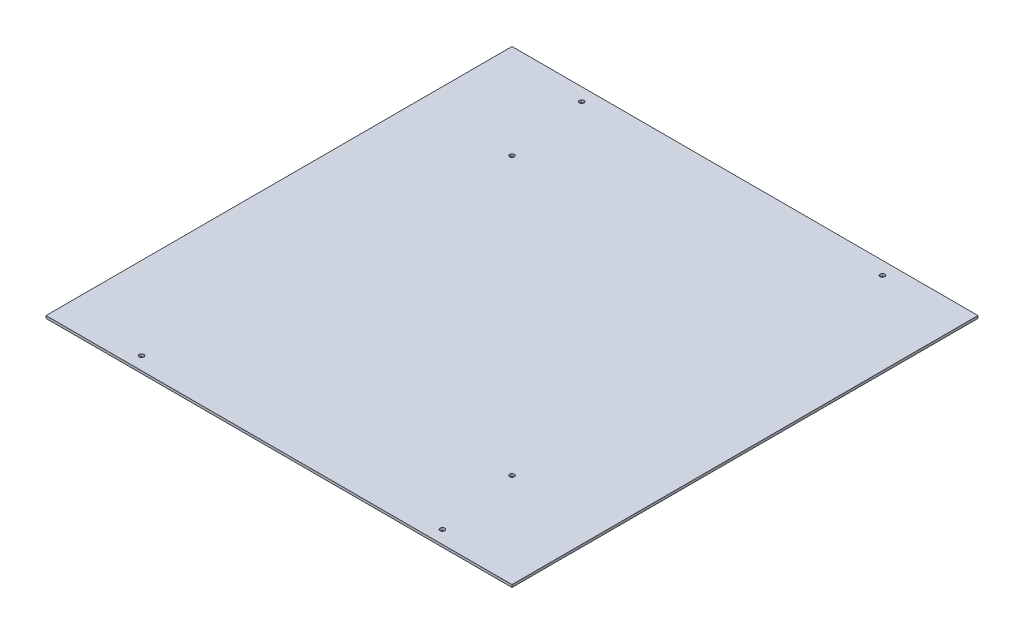
ISO-10303-21;
HEADER;
FILE_DESCRIPTION(('STEP AP214'),'2;1');
FILE_NAME('part.step','',(''),(''),'','','');
FILE_SCHEMA(('AUTOMOTIVE_DESIGN { 1 0 10303 214 1 1 1 1 }'));
ENDSEC;
DATA;
#1=APPLICATION_CONTEXT('core data for automotive mechanical design processes');
#2=APPLICATION_PROTOCOL_DEFINITION('international standard','automotive_design',2000,#1);
#3=PRODUCT_CONTEXT('',#1,'mechanical');
#4=PRODUCT('Part','Part','',(#3));
#5=PRODUCT_RELATED_PRODUCT_CATEGORY('part','',(#4));
#6=PRODUCT_DEFINITION_FORMATION('','',#4);
#7=PRODUCT_DEFINITION_CONTEXT('part definition',#1,'design');
#8=PRODUCT_DEFINITION('design','',#6,#7);
#9=PRODUCT_DEFINITION_SHAPE('','',#8);
#10=(LENGTH_UNIT() NAMED_UNIT(*) SI_UNIT(.MILLI.,.METRE.));
#11=(NAMED_UNIT(*) PLANE_ANGLE_UNIT() SI_UNIT($,.RADIAN.));
#12=(NAMED_UNIT(*) SI_UNIT($,.STERADIAN.) SOLID_ANGLE_UNIT());
#13=UNCERTAINTY_MEASURE_WITH_UNIT(LENGTH_MEASURE(1.E-05),#10,'distance_accuracy_value','');
#14=(GEOMETRIC_REPRESENTATION_CONTEXT(3) GLOBAL_UNCERTAINTY_ASSIGNED_CONTEXT((#13)) GLOBAL_UNIT_ASSIGNED_CONTEXT((#10,
#11,#12)) REPRESENTATION_CONTEXT('',''));
#15=CARTESIAN_POINT('',(0.,0.,0.));
#16=DIRECTION('',(0.,0.,1.));
#17=DIRECTION('',(1.,0.,0.));
#18=AXIS2_PLACEMENT_3D('',#15,#16,#17);
#19=CARTESIAN_POINT('',(0.,1.9,0.));
#20=DIRECTION('',(1.,0.,0.));
#21=DIRECTION('',(0.,0.,-1.));
#22=AXIS2_PLACEMENT_3D('',#19,#20,#21);
#23=PLANE('',#22);
#24=DIRECTION('',(0.,0.,1.));
#25=VECTOR('',#24,1.);
#26=CARTESIAN_POINT('',(0.,0.,0.));
#27=LINE('',#26,#25);
#28=CARTESIAN_POINT('',(0.,0.,-350.));
#29=VERTEX_POINT('',#28);
#30=CARTESIAN_POINT('',(0.,0.,0.));
#31=VERTEX_POINT('',#30);
#32=EDGE_CURVE('E100',#29,#31,#27,.T.);
#33=ORIENTED_EDGE('',*,*,#32,.T.);
#34=DIRECTION('',(0.,-1.,0.));
#35=VECTOR('',#34,1.);
#36=CARTESIAN_POINT('',(0.,1.9,0.));
#37=LINE('',#36,#35);
#38=CARTESIAN_POINT('',(0.,1.9,0.));
#39=VERTEX_POINT('',#38);
#40=EDGE_CURVE('E11',#39,#31,#37,.T.);
#41=ORIENTED_EDGE('',*,*,#40,.F.);
#42=DIRECTION('',(0.,0.,1.));
#43=VECTOR('',#42,1.);
#44=CARTESIAN_POINT('',(0.,1.9,0.));
#45=LINE('',#44,#43);
#46=CARTESIAN_POINT('',(0.,1.9,-350.));
#47=VERTEX_POINT('',#46);
#48=EDGE_CURVE('E88',#47,#39,#45,.T.);
#49=ORIENTED_EDGE('',*,*,#48,.F.);
#50=DIRECTION('',(0.,-1.,0.));
#51=VECTOR('',#50,1.);
#52=CARTESIAN_POINT('',(0.,1.9,-350.));
#53=LINE('',#52,#51);
#54=EDGE_CURVE('E96',#47,#29,#53,.T.);
#55=ORIENTED_EDGE('',*,*,#54,.T.);
#56=EDGE_LOOP('',(#33,#41,#49,#55));
#57=FACE_BOUND('',#56,.T.);
#58=ADVANCED_FACE('F37',(#57),#23,.F.);
#59=CARTESIAN_POINT('',(0.,1.9,0.));
#60=DIRECTION('',(0.,0.,-1.));
#61=DIRECTION('',(-1.,0.,0.));
#62=AXIS2_PLACEMENT_3D('',#59,#60,#61);
#63=PLANE('',#62);
#64=DIRECTION('',(1.,0.,0.));
#65=VECTOR('',#64,1.);
#66=CARTESIAN_POINT('',(0.,0.,0.));
#67=LINE('',#66,#65);
#68=CARTESIAN_POINT('',(350.,0.,0.));
#69=VERTEX_POINT('',#68);
#70=EDGE_CURVE('E92',#31,#69,#67,.T.);
#71=ORIENTED_EDGE('',*,*,#70,.T.);
#72=DIRECTION('',(0.,-1.,0.));
#73=VECTOR('',#72,1.);
#74=CARTESIAN_POINT('',(350.,1.9,0.));
#75=LINE('',#74,#73);
#76=CARTESIAN_POINT('',(350.,1.9,0.));
#77=VERTEX_POINT('',#76);
#78=EDGE_CURVE('E45',#77,#69,#75,.T.);
#79=ORIENTED_EDGE('',*,*,#78,.F.);
#80=DIRECTION('',(1.,0.,0.));
#81=VECTOR('',#80,1.);
#82=CARTESIAN_POINT('',(0.,1.9,0.));
#83=LINE('',#82,#81);
#84=EDGE_CURVE('E83',#39,#77,#83,.T.);
#85=ORIENTED_EDGE('',*,*,#84,.F.);
#86=ORIENTED_EDGE('',*,*,#40,.T.);
#87=EDGE_LOOP('',(#71,#79,#85,#86));
#88=FACE_BOUND('',#87,.T.);
#89=ADVANCED_FACE('F91',(#88),#63,.F.);
#90=CARTESIAN_POINT('',(350.,1.9,0.));
#91=DIRECTION('',(-1.,0.,0.));
#92=DIRECTION('',(0.,0.,1.));
#93=AXIS2_PLACEMENT_3D('',#90,#91,#92);
#94=PLANE('',#93);
#95=DIRECTION('',(0.,0.,-1.));
#96=VECTOR('',#95,1.);
#97=CARTESIAN_POINT('',(350.,0.,0.));
#98=LINE('',#97,#96);
#99=CARTESIAN_POINT('',(350.,0.,-350.));
#100=VERTEX_POINT('',#99);
#101=EDGE_CURVE('E70',#69,#100,#98,.T.);
#102=ORIENTED_EDGE('',*,*,#101,.T.);
#103=DIRECTION('',(0.,-1.,0.));
#104=VECTOR('',#103,1.);
#105=CARTESIAN_POINT('',(350.,1.9,-350.));
#106=LINE('',#105,#104);
#107=CARTESIAN_POINT('',(350.,1.9,-350.));
#108=VERTEX_POINT('',#107);
#109=EDGE_CURVE('E93',#108,#100,#106,.T.);
#110=ORIENTED_EDGE('',*,*,#109,.F.);
#111=DIRECTION('',(0.,0.,-1.));
#112=VECTOR('',#111,1.);
#113=CARTESIAN_POINT('',(350.,1.9,0.));
#114=LINE('',#113,#112);
#115=EDGE_CURVE('E86',#77,#108,#114,.T.);
#116=ORIENTED_EDGE('',*,*,#115,.F.);
#117=ORIENTED_EDGE('',*,*,#78,.T.);
#118=EDGE_LOOP('',(#102,#110,#116,#117));
#119=FACE_BOUND('',#118,.T.);
#120=ADVANCED_FACE('F94',(#119),#94,.F.);
#121=CARTESIAN_POINT('',(0.,1.9,-350.));
#122=DIRECTION('',(0.,0.,1.));
#123=DIRECTION('',(1.,0.,0.));
#124=AXIS2_PLACEMENT_3D('',#121,#122,#123);
#125=PLANE('',#124);
#126=DIRECTION('',(-1.,0.,0.));
#127=VECTOR('',#126,1.);
#128=CARTESIAN_POINT('',(0.,0.,-350.));
#129=LINE('',#128,#127);
#130=EDGE_CURVE('E76',#100,#29,#129,.T.);
#131=ORIENTED_EDGE('',*,*,#130,.T.);
#132=ORIENTED_EDGE('',*,*,#54,.F.);
#133=DIRECTION('',(-1.,0.,0.));
#134=VECTOR('',#133,1.);
#135=CARTESIAN_POINT('',(0.,1.9,-350.));
#136=LINE('',#135,#134);
#137=EDGE_CURVE('E53',#108,#47,#136,.T.);
#138=ORIENTED_EDGE('',*,*,#137,.F.);
#139=ORIENTED_EDGE('',*,*,#109,.T.);
#140=EDGE_LOOP('',(#131,#132,#138,#139));
#141=FACE_BOUND('',#140,.T.);
#142=ADVANCED_FACE('F108',(#141),#125,.F.);
#143=CARTESIAN_POINT('',(0.,1.9,0.));
#144=DIRECTION('',(0.,-1.,0.));
#145=DIRECTION('',(0.,0.,-1.));
#146=AXIS2_PLACEMENT_3D('',#143,#144,#145);
#147=PLANE('',#146);
#148=CARTESIAN_POINT('',(71.,1.9,-279.));
#149=DIRECTION('',(0.,1.,0.));
#150=DIRECTION('',(0.,0.,1.));
#151=AXIS2_PLACEMENT_3D('',#148,#149,#150);
#152=CIRCLE('',#151,1.75);
#153=CARTESIAN_POINT('',(71.,1.9,-277.25));
#154=VERTEX_POINT('',#153);
#155=EDGE_CURVE('E132',#154,#154,#152,.T.);
#156=ORIENTED_EDGE('',*,*,#155,.F.);
#157=EDGE_LOOP('',(#156));
#158=FACE_BOUND('',#157,.T.);
#159=CARTESIAN_POINT('',(288.,1.9,-9.75));
#160=DIRECTION('',(0.,1.,0.));
#161=DIRECTION('',(0.,0.,1.));
#162=AXIS2_PLACEMENT_3D('',#159,#160,#161);
#163=CIRCLE('',#162,1.74999999999998);
#164=CARTESIAN_POINT('',(288.,1.9,-8.00000000000002));
#165=VERTEX_POINT('',#164);
#166=EDGE_CURVE('E139',#165,#165,#163,.T.);
#167=ORIENTED_EDGE('',*,*,#166,.F.);
#168=EDGE_LOOP('',(#167));
#169=FACE_BOUND('',#168,.T.);
#170=CARTESIAN_POINT('',(62.,1.9,-9.75));
#171=DIRECTION('',(0.,1.,0.));
#172=DIRECTION('',(0.,0.,1.));
#173=AXIS2_PLACEMENT_3D('',#170,#171,#172);
#174=CIRCLE('',#173,1.75);
#175=CARTESIAN_POINT('',(62.,1.9,-8.00000000000001));
#176=VERTEX_POINT('',#175);
#177=EDGE_CURVE('E120',#176,#176,#174,.T.);
#178=ORIENTED_EDGE('',*,*,#177,.F.);
#179=EDGE_LOOP('',(#178));
#180=FACE_BOUND('',#179,.T.);
#181=CARTESIAN_POINT('',(288.,1.9,-340.25));
#182=DIRECTION('',(0.,1.,0.));
#183=DIRECTION('',(0.,0.,1.));
#184=AXIS2_PLACEMENT_3D('',#181,#182,#183);
#185=CIRCLE('',#184,1.74999999999998);
#186=CARTESIAN_POINT('',(288.,1.9,-338.5));
#187=VERTEX_POINT('',#186);
#188=EDGE_CURVE('E127',#187,#187,#185,.T.);
#189=ORIENTED_EDGE('',*,*,#188,.F.);
#190=EDGE_LOOP('',(#189));
#191=FACE_BOUND('',#190,.T.);
#192=CARTESIAN_POINT('',(279.007361648572,1.9,-71.));
#193=DIRECTION('',(0.,1.,0.));
#194=DIRECTION('',(0.,0.,1.));
#195=AXIS2_PLACEMENT_3D('',#192,#193,#194);
#196=CIRCLE('',#195,1.75000000000004);
#197=CARTESIAN_POINT('',(279.007361648572,1.9,-69.25));
#198=VERTEX_POINT('',#197);
#199=EDGE_CURVE('E144',#198,#198,#196,.T.);
#200=ORIENTED_EDGE('',*,*,#199,.F.);
#201=EDGE_LOOP('',(#200));
#202=FACE_BOUND('',#201,.T.);
#203=CARTESIAN_POINT('',(62.,1.9,-340.25));
#204=DIRECTION('',(0.,1.,0.));
#205=DIRECTION('',(0.,0.,1.));
#206=AXIS2_PLACEMENT_3D('',#203,#204,#205);
#207=CIRCLE('',#206,1.75);
#208=CARTESIAN_POINT('',(62.,1.9,-338.5));
#209=VERTEX_POINT('',#208);
#210=EDGE_CURVE('E114',#209,#209,#207,.T.);
#211=ORIENTED_EDGE('',*,*,#210,.F.);
#212=EDGE_LOOP('',(#211));
#213=FACE_BOUND('',#212,.T.);
#214=ORIENTED_EDGE('',*,*,#48,.T.);
#215=ORIENTED_EDGE('',*,*,#84,.T.);
#216=ORIENTED_EDGE('',*,*,#115,.T.);
#217=ORIENTED_EDGE('',*,*,#137,.T.);
#218=EDGE_LOOP('',(#214,#215,#216,#217));
#219=FACE_BOUND('',#218,.T.);
#220=ADVANCED_FACE('F84',(#158,#169,#180,#191,#202,#213,#219),#147,.F.);
#221=CARTESIAN_POINT('',(0.,0.,0.));
#222=DIRECTION('',(0.,-1.,0.));
#223=DIRECTION('',(0.,0.,-1.));
#224=AXIS2_PLACEMENT_3D('',#221,#222,#223);
#225=PLANE('',#224);
#226=CARTESIAN_POINT('',(71.,0.,-279.));
#227=DIRECTION('',(0.,1.,0.));
#228=DIRECTION('',(0.,0.,1.));
#229=AXIS2_PLACEMENT_3D('',#226,#227,#228);
#230=CIRCLE('',#229,1.75);
#231=CARTESIAN_POINT('',(71.,0.,-277.25));
#232=VERTEX_POINT('',#231);
#233=EDGE_CURVE('E135',#232,#232,#230,.T.);
#234=ORIENTED_EDGE('',*,*,#233,.T.);
#235=EDGE_LOOP('',(#234));
#236=FACE_BOUND('',#235,.T.);
#237=CARTESIAN_POINT('',(288.,0.,-9.75));
#238=DIRECTION('',(0.,1.,0.));
#239=DIRECTION('',(0.,0.,1.));
#240=AXIS2_PLACEMENT_3D('',#237,#238,#239);
#241=CIRCLE('',#240,1.74999999999998);
#242=CARTESIAN_POINT('',(288.,0.,-8.00000000000002));
#243=VERTEX_POINT('',#242);
#244=EDGE_CURVE('E124',#243,#243,#241,.T.);
#245=ORIENTED_EDGE('',*,*,#244,.T.);
#246=EDGE_LOOP('',(#245));
#247=FACE_BOUND('',#246,.T.);
#248=CARTESIAN_POINT('',(62.,0.,-9.75));
#249=DIRECTION('',(0.,1.,0.));
#250=DIRECTION('',(0.,0.,1.));
#251=AXIS2_PLACEMENT_3D('',#248,#249,#250);
#252=CIRCLE('',#251,1.75);
#253=CARTESIAN_POINT('',(62.,0.,-8.00000000000001));
#254=VERTEX_POINT('',#253);
#255=EDGE_CURVE('E123',#254,#254,#252,.T.);
#256=ORIENTED_EDGE('',*,*,#255,.T.);
#257=EDGE_LOOP('',(#256));
#258=FACE_BOUND('',#257,.T.);
#259=CARTESIAN_POINT('',(288.,0.,-340.25));
#260=DIRECTION('',(0.,1.,0.));
#261=DIRECTION('',(0.,0.,1.));
#262=AXIS2_PLACEMENT_3D('',#259,#260,#261);
#263=CIRCLE('',#262,1.74999999999998);
#264=CARTESIAN_POINT('',(288.,0.,-338.5));
#265=VERTEX_POINT('',#264);
#266=EDGE_CURVE('E117',#265,#265,#263,.T.);
#267=ORIENTED_EDGE('',*,*,#266,.T.);
#268=EDGE_LOOP('',(#267));
#269=FACE_BOUND('',#268,.T.);
#270=CARTESIAN_POINT('',(279.007361648572,0.,-71.));
#271=DIRECTION('',(0.,1.,0.));
#272=DIRECTION('',(0.,0.,1.));
#273=AXIS2_PLACEMENT_3D('',#270,#271,#272);
#274=CIRCLE('',#273,1.75000000000004);
#275=CARTESIAN_POINT('',(279.007361648572,0.,-69.25));
#276=VERTEX_POINT('',#275);
#277=EDGE_CURVE('E136',#276,#276,#274,.T.);
#278=ORIENTED_EDGE('',*,*,#277,.T.);
#279=EDGE_LOOP('',(#278));
#280=FACE_BOUND('',#279,.T.);
#281=CARTESIAN_POINT('',(62.,0.,-340.25));
#282=DIRECTION('',(0.,1.,0.));
#283=DIRECTION('',(0.,0.,1.));
#284=AXIS2_PLACEMENT_3D('',#281,#282,#283);
#285=CIRCLE('',#284,1.75);
#286=CARTESIAN_POINT('',(62.,0.,-338.5));
#287=VERTEX_POINT('',#286);
#288=EDGE_CURVE('E103',#287,#287,#285,.T.);
#289=ORIENTED_EDGE('',*,*,#288,.T.);
#290=EDGE_LOOP('',(#289));
#291=FACE_BOUND('',#290,.T.);
#292=ORIENTED_EDGE('',*,*,#32,.F.);
#293=ORIENTED_EDGE('',*,*,#130,.F.);
#294=ORIENTED_EDGE('',*,*,#101,.F.);
#295=ORIENTED_EDGE('',*,*,#70,.F.);
#296=EDGE_LOOP('',(#292,#293,#294,#295));
#297=FACE_BOUND('',#296,.T.);
#298=ADVANCED_FACE('F111',(#236,#247,#258,#269,#280,#291,#297),#225,.T.);
#299=CARTESIAN_POINT('',(62.,0.,-340.25));
#300=DIRECTION('',(0.,1.,0.));
#301=DIRECTION('',(0.,0.,1.));
#302=AXIS2_PLACEMENT_3D('',#299,#300,#301);
#303=CYLINDRICAL_SURFACE('',#302,1.75);
#304=CARTESIAN_POINT('',(62.,0.,-338.5));
#305=CARTESIAN_POINT('',(62.,0.0197916666666666,-338.5));
#306=CARTESIAN_POINT('',(62.,0.0395833333333333,-338.5));
#307=CARTESIAN_POINT('',(62.,0.0791666666666667,-338.5));
#308=CARTESIAN_POINT('',(62.,0.0989583333333333,-338.5));
#309=CARTESIAN_POINT('',(62.,0.138541666666667,-338.5));
#310=CARTESIAN_POINT('',(62.,0.158333333333333,-338.5));
#311=CARTESIAN_POINT('',(62.,0.197916666666667,-338.5));
#312=CARTESIAN_POINT('',(62.,0.217708333333333,-338.5));
#313=CARTESIAN_POINT('',(62.,0.257291666666667,-338.5));
#314=CARTESIAN_POINT('',(62.,0.277083333333333,-338.5));
#315=CARTESIAN_POINT('',(62.,0.316666666666667,-338.5));
#316=CARTESIAN_POINT('',(62.,0.336458333333333,-338.5));
#317=CARTESIAN_POINT('',(62.,0.376041666666667,-338.5));
#318=CARTESIAN_POINT('',(62.,0.395833333333333,-338.5));
#319=CARTESIAN_POINT('',(62.,0.435416666666667,-338.5));
#320=CARTESIAN_POINT('',(62.,0.455208333333333,-338.5));
#321=CARTESIAN_POINT('',(62.,0.494791666666667,-338.5));
#322=CARTESIAN_POINT('',(62.,0.514583333333333,-338.5));
#323=CARTESIAN_POINT('',(62.,0.554166666666667,-338.5));
#324=CARTESIAN_POINT('',(62.,0.573958333333333,-338.5));
#325=CARTESIAN_POINT('',(62.,0.613541666666667,-338.5));
#326=CARTESIAN_POINT('',(62.,0.633333333333333,-338.5));
#327=CARTESIAN_POINT('',(62.,0.672916666666667,-338.5));
#328=CARTESIAN_POINT('',(62.,0.692708333333333,-338.5));
#329=CARTESIAN_POINT('',(62.,0.732291666666667,-338.5));
#330=CARTESIAN_POINT('',(62.,0.752083333333333,-338.5));
#331=CARTESIAN_POINT('',(62.,0.791666666666667,-338.5));
#332=CARTESIAN_POINT('',(62.,0.811458333333333,-338.5));
#333=CARTESIAN_POINT('',(62.,0.851041666666667,-338.5));
#334=CARTESIAN_POINT('',(62.,0.870833333333333,-338.5));
#335=CARTESIAN_POINT('',(62.,0.910416666666667,-338.5));
#336=CARTESIAN_POINT('',(62.,0.930208333333333,-338.5));
#337=CARTESIAN_POINT('',(62.,0.969791666666667,-338.5));
#338=CARTESIAN_POINT('',(62.,0.989583333333333,-338.5));
#339=CARTESIAN_POINT('',(62.,1.02916666666667,-338.5));
#340=CARTESIAN_POINT('',(62.,1.04895833333333,-338.5));
#341=CARTESIAN_POINT('',(62.,1.08854166666667,-338.5));
#342=CARTESIAN_POINT('',(62.,1.10833333333333,-338.5));
#343=CARTESIAN_POINT('',(62.,1.14791666666667,-338.5));
#344=CARTESIAN_POINT('',(62.,1.16770833333333,-338.5));
#345=CARTESIAN_POINT('',(62.,1.20729166666667,-338.5));
#346=CARTESIAN_POINT('',(62.,1.22708333333333,-338.5));
#347=CARTESIAN_POINT('',(62.,1.26666666666667,-338.5));
#348=CARTESIAN_POINT('',(62.,1.28645833333333,-338.5));
#349=CARTESIAN_POINT('',(62.,1.32604166666667,-338.5));
#350=CARTESIAN_POINT('',(62.,1.34583333333333,-338.5));
#351=CARTESIAN_POINT('',(62.,1.38541666666667,-338.5));
#352=CARTESIAN_POINT('',(62.,1.40520833333333,-338.5));
#353=CARTESIAN_POINT('',(62.,1.44479166666667,-338.5));
#354=CARTESIAN_POINT('',(62.,1.46458333333333,-338.5));
#355=CARTESIAN_POINT('',(62.,1.50416666666667,-338.5));
#356=CARTESIAN_POINT('',(62.,1.52395833333333,-338.5));
#357=CARTESIAN_POINT('',(62.,1.56354166666667,-338.5));
#358=CARTESIAN_POINT('',(62.,1.58333333333333,-338.5));
#359=CARTESIAN_POINT('',(62.,1.62291666666667,-338.5));
#360=CARTESIAN_POINT('',(62.,1.64270833333333,-338.5));
#361=CARTESIAN_POINT('',(62.,1.68229166666667,-338.5));
#362=CARTESIAN_POINT('',(62.,1.70208333333333,-338.5));
#363=CARTESIAN_POINT('',(62.,1.74166666666667,-338.5));
#364=CARTESIAN_POINT('',(62.,1.76145833333333,-338.5));
#365=CARTESIAN_POINT('',(62.,1.80104166666667,-338.5));
#366=CARTESIAN_POINT('',(62.,1.82083333333333,-338.5));
#367=CARTESIAN_POINT('',(62.,1.86041666666667,-338.5));
#368=CARTESIAN_POINT('',(62.,1.88020833333333,-338.5));
#369=CARTESIAN_POINT('',(62.,1.9,-338.5));
#370=B_SPLINE_CURVE_WITH_KNOTS('',3,(#304,#305,#306,#307,#308,#309,#310,#311,#312,#313,#314,
#315,#316,#317,#318,#319,#320,#321,#322,#323,#324,#325,#326,#327,#328,#329,#330,#331,#332,#333,
#334,#335,#336,#337,#338,#339,#340,#341,#342,#343,#344,#345,#346,#347,#348,#349,#350,#351,#352,
#353,#354,#355,#356,#357,#358,#359,#360,#361,#362,#363,#364,#365,#366,#367,#368,#369),
.UNSPECIFIED.,.F.,.F.,(4,2,2,2,2,2,2,2,2,2,2,2,2,2,2,2,2,2,2,2,2,2,2,2,2,2,2,2,2,2,2,2,4),(0.,
0.059375,0.11875,0.178125,0.2375,0.296875,0.35625,0.415625,0.475,0.534375,0.59375,0.653125,
0.7125,0.771875,0.83125,0.890625,0.95,1.009375,1.06875,1.128125,1.1875,1.246875,1.30625,
1.365625,1.425,1.484375,1.54375,1.603125,1.6625,1.721875,1.78125,1.840625,1.9),.UNSPECIFIED.);
#371=EDGE_CURVE('BSEAM156',#287,#209,#370,.T.);
#372=ORIENTED_EDGE('',*,*,#288,.F.);
#373=ORIENTED_EDGE('',*,*,#210,.T.);
#374=ORIENTED_EDGE('',*,*,#371,.T.);
#375=ORIENTED_EDGE('',*,*,#371,.F.);
#376=EDGE_LOOP('',(#372,#374,#373,#375));
#377=FACE_BOUND('',#376,.T.);
#378=ADVANCED_FACE('F156',(#377),#303,.F.);
#379=CARTESIAN_POINT('',(279.007361648572,0.,-71.));
#380=DIRECTION('',(0.,1.,0.));
#381=DIRECTION('',(0.,0.,1.));
#382=AXIS2_PLACEMENT_3D('',#379,#380,#381);
#383=CYLINDRICAL_SURFACE('',#382,1.75000000000004);
#384=CARTESIAN_POINT('',(279.007361648572,0.,-69.25));
#385=CARTESIAN_POINT('',(279.007361648572,0.0197916666666666,-69.25));
#386=CARTESIAN_POINT('',(279.007361648572,0.0395833333333333,-69.25));
#387=CARTESIAN_POINT('',(279.007361648572,0.0791666666666667,-69.25));
#388=CARTESIAN_POINT('',(279.007361648572,0.0989583333333333,-69.25));
#389=CARTESIAN_POINT('',(279.007361648572,0.138541666666667,-69.25));
#390=CARTESIAN_POINT('',(279.007361648572,0.158333333333333,-69.25));
#391=CARTESIAN_POINT('',(279.007361648572,0.197916666666667,-69.25));
#392=CARTESIAN_POINT('',(279.007361648572,0.217708333333333,-69.25));
#393=CARTESIAN_POINT('',(279.007361648572,0.257291666666667,-69.25));
#394=CARTESIAN_POINT('',(279.007361648572,0.277083333333333,-69.25));
#395=CARTESIAN_POINT('',(279.007361648572,0.316666666666667,-69.25));
#396=CARTESIAN_POINT('',(279.007361648572,0.336458333333333,-69.25));
#397=CARTESIAN_POINT('',(279.007361648572,0.376041666666667,-69.25));
#398=CARTESIAN_POINT('',(279.007361648572,0.395833333333333,-69.25));
#399=CARTESIAN_POINT('',(279.007361648572,0.435416666666667,-69.25));
#400=CARTESIAN_POINT('',(279.007361648572,0.455208333333333,-69.25));
#401=CARTESIAN_POINT('',(279.007361648572,0.494791666666667,-69.25));
#402=CARTESIAN_POINT('',(279.007361648572,0.514583333333333,-69.25));
#403=CARTESIAN_POINT('',(279.007361648572,0.554166666666667,-69.25));
#404=CARTESIAN_POINT('',(279.007361648572,0.573958333333333,-69.25));
#405=CARTESIAN_POINT('',(279.007361648572,0.613541666666667,-69.25));
#406=CARTESIAN_POINT('',(279.007361648572,0.633333333333333,-69.25));
#407=CARTESIAN_POINT('',(279.007361648572,0.672916666666667,-69.25));
#408=CARTESIAN_POINT('',(279.007361648572,0.692708333333333,-69.25));
#409=CARTESIAN_POINT('',(279.007361648572,0.732291666666667,-69.25));
#410=CARTESIAN_POINT('',(279.007361648572,0.752083333333333,-69.25));
#411=CARTESIAN_POINT('',(279.007361648572,0.791666666666667,-69.25));
#412=CARTESIAN_POINT('',(279.007361648572,0.811458333333333,-69.25));
#413=CARTESIAN_POINT('',(279.007361648572,0.851041666666667,-69.25));
#414=CARTESIAN_POINT('',(279.007361648572,0.870833333333333,-69.25));
#415=CARTESIAN_POINT('',(279.007361648572,0.910416666666667,-69.25));
#416=CARTESIAN_POINT('',(279.007361648572,0.930208333333333,-69.25));
#417=CARTESIAN_POINT('',(279.007361648572,0.969791666666667,-69.25));
#418=CARTESIAN_POINT('',(279.007361648572,0.989583333333333,-69.25));
#419=CARTESIAN_POINT('',(279.007361648572,1.02916666666667,-69.25));
#420=CARTESIAN_POINT('',(279.007361648572,1.04895833333333,-69.25));
#421=CARTESIAN_POINT('',(279.007361648572,1.08854166666667,-69.25));
#422=CARTESIAN_POINT('',(279.007361648572,1.10833333333333,-69.25));
#423=CARTESIAN_POINT('',(279.007361648572,1.14791666666667,-69.25));
#424=CARTESIAN_POINT('',(279.007361648572,1.16770833333333,-69.25));
#425=CARTESIAN_POINT('',(279.007361648572,1.20729166666667,-69.25));
#426=CARTESIAN_POINT('',(279.007361648572,1.22708333333333,-69.25));
#427=CARTESIAN_POINT('',(279.007361648572,1.26666666666667,-69.25));
#428=CARTESIAN_POINT('',(279.007361648572,1.28645833333333,-69.25));
#429=CARTESIAN_POINT('',(279.007361648572,1.32604166666667,-69.25));
#430=CARTESIAN_POINT('',(279.007361648572,1.34583333333333,-69.25));
#431=CARTESIAN_POINT('',(279.007361648572,1.38541666666667,-69.25));
#432=CARTESIAN_POINT('',(279.007361648572,1.40520833333333,-69.25));
#433=CARTESIAN_POINT('',(279.007361648572,1.44479166666667,-69.25));
#434=CARTESIAN_POINT('',(279.007361648572,1.46458333333333,-69.25));
#435=CARTESIAN_POINT('',(279.007361648572,1.50416666666667,-69.25));
#436=CARTESIAN_POINT('',(279.007361648572,1.52395833333333,-69.25));
#437=CARTESIAN_POINT('',(279.007361648572,1.56354166666667,-69.25));
#438=CARTESIAN_POINT('',(279.007361648572,1.58333333333333,-69.25));
#439=CARTESIAN_POINT('',(279.007361648572,1.62291666666667,-69.25));
#440=CARTESIAN_POINT('',(279.007361648572,1.64270833333333,-69.25));
#441=CARTESIAN_POINT('',(279.007361648572,1.68229166666667,-69.25));
#442=CARTESIAN_POINT('',(279.007361648572,1.70208333333333,-69.25));
#443=CARTESIAN_POINT('',(279.007361648572,1.74166666666667,-69.25));
#444=CARTESIAN_POINT('',(279.007361648572,1.76145833333333,-69.25));
#445=CARTESIAN_POINT('',(279.007361648572,1.80104166666667,-69.25));
#446=CARTESIAN_POINT('',(279.007361648572,1.82083333333333,-69.25));
#447=CARTESIAN_POINT('',(279.007361648572,1.86041666666667,-69.25));
#448=CARTESIAN_POINT('',(279.007361648572,1.88020833333333,-69.25));
#449=CARTESIAN_POINT('',(279.007361648572,1.9,-69.25));
#450=B_SPLINE_CURVE_WITH_KNOTS('',3,(#384,#385,#386,#387,#388,#389,#390,#391,#392,#393,#394,
#395,#396,#397,#398,#399,#400,#401,#402,#403,#404,#405,#406,#407,#408,#409,#410,#411,#412,#413,
#414,#415,#416,#417,#418,#419,#420,#421,#422,#423,#424,#425,#426,#427,#428,#429,#430,#431,#432,
#433,#434,#435,#436,#437,#438,#439,#440,#441,#442,#443,#444,#445,#446,#447,#448,#449),
.UNSPECIFIED.,.F.,.F.,(4,2,2,2,2,2,2,2,2,2,2,2,2,2,2,2,2,2,2,2,2,2,2,2,2,2,2,2,2,2,2,2,4),(0.,
0.059375,0.11875,0.178125,0.2375,0.296875,0.35625,0.415625,0.475,0.534375,0.59375,0.653125,
0.7125,0.771875,0.83125,0.890625,0.95,1.009375,1.06875,1.128125,1.1875,1.246875,1.30625,
1.365625,1.425,1.484375,1.54375,1.603125,1.6625,1.721875,1.78125,1.840625,1.9),.UNSPECIFIED.);
#451=EDGE_CURVE('BSEAM152',#276,#198,#450,.T.);
#452=ORIENTED_EDGE('',*,*,#277,.F.);
#453=ORIENTED_EDGE('',*,*,#199,.T.);
#454=ORIENTED_EDGE('',*,*,#451,.T.);
#455=ORIENTED_EDGE('',*,*,#451,.F.);
#456=EDGE_LOOP('',(#452,#454,#453,#455));
#457=FACE_BOUND('',#456,.T.);
#458=ADVANCED_FACE('F152',(#457),#383,.F.);
#459=CARTESIAN_POINT('',(288.,0.,-340.25));
#460=DIRECTION('',(0.,1.,0.));
#461=DIRECTION('',(0.,0.,1.));
#462=AXIS2_PLACEMENT_3D('',#459,#460,#461);
#463=CYLINDRICAL_SURFACE('',#462,1.74999999999998);
#464=CARTESIAN_POINT('',(288.,0.,-338.5));
#465=CARTESIAN_POINT('',(288.,0.0197916666666666,-338.5));
#466=CARTESIAN_POINT('',(288.,0.0395833333333333,-338.5));
#467=CARTESIAN_POINT('',(288.,0.0791666666666667,-338.5));
#468=CARTESIAN_POINT('',(288.,0.0989583333333333,-338.5));
#469=CARTESIAN_POINT('',(288.,0.138541666666667,-338.5));
#470=CARTESIAN_POINT('',(288.,0.158333333333333,-338.5));
#471=CARTESIAN_POINT('',(288.,0.197916666666667,-338.5));
#472=CARTESIAN_POINT('',(288.,0.217708333333333,-338.5));
#473=CARTESIAN_POINT('',(288.,0.257291666666667,-338.5));
#474=CARTESIAN_POINT('',(288.,0.277083333333333,-338.5));
#475=CARTESIAN_POINT('',(288.,0.316666666666667,-338.5));
#476=CARTESIAN_POINT('',(288.,0.336458333333333,-338.5));
#477=CARTESIAN_POINT('',(288.,0.376041666666667,-338.5));
#478=CARTESIAN_POINT('',(288.,0.395833333333333,-338.5));
#479=CARTESIAN_POINT('',(288.,0.435416666666667,-338.5));
#480=CARTESIAN_POINT('',(288.,0.455208333333333,-338.5));
#481=CARTESIAN_POINT('',(288.,0.494791666666667,-338.5));
#482=CARTESIAN_POINT('',(288.,0.514583333333333,-338.5));
#483=CARTESIAN_POINT('',(288.,0.554166666666667,-338.5));
#484=CARTESIAN_POINT('',(288.,0.573958333333333,-338.5));
#485=CARTESIAN_POINT('',(288.,0.613541666666667,-338.5));
#486=CARTESIAN_POINT('',(288.,0.633333333333333,-338.5));
#487=CARTESIAN_POINT('',(288.,0.672916666666667,-338.5));
#488=CARTESIAN_POINT('',(288.,0.692708333333333,-338.5));
#489=CARTESIAN_POINT('',(288.,0.732291666666667,-338.5));
#490=CARTESIAN_POINT('',(288.,0.752083333333333,-338.5));
#491=CARTESIAN_POINT('',(288.,0.791666666666667,-338.5));
#492=CARTESIAN_POINT('',(288.,0.811458333333333,-338.5));
#493=CARTESIAN_POINT('',(288.,0.851041666666667,-338.5));
#494=CARTESIAN_POINT('',(288.,0.870833333333333,-338.5));
#495=CARTESIAN_POINT('',(288.,0.910416666666667,-338.5));
#496=CARTESIAN_POINT('',(288.,0.930208333333333,-338.5));
#497=CARTESIAN_POINT('',(288.,0.969791666666667,-338.5));
#498=CARTESIAN_POINT('',(288.,0.989583333333333,-338.5));
#499=CARTESIAN_POINT('',(288.,1.02916666666667,-338.5));
#500=CARTESIAN_POINT('',(288.,1.04895833333333,-338.5));
#501=CARTESIAN_POINT('',(288.,1.08854166666667,-338.5));
#502=CARTESIAN_POINT('',(288.,1.10833333333333,-338.5));
#503=CARTESIAN_POINT('',(288.,1.14791666666667,-338.5));
#504=CARTESIAN_POINT('',(288.,1.16770833333333,-338.5));
#505=CARTESIAN_POINT('',(288.,1.20729166666667,-338.5));
#506=CARTESIAN_POINT('',(288.,1.22708333333333,-338.5));
#507=CARTESIAN_POINT('',(288.,1.26666666666667,-338.5));
#508=CARTESIAN_POINT('',(288.,1.28645833333333,-338.5));
#509=CARTESIAN_POINT('',(288.,1.32604166666667,-338.5));
#510=CARTESIAN_POINT('',(288.,1.34583333333333,-338.5));
#511=CARTESIAN_POINT('',(288.,1.38541666666667,-338.5));
#512=CARTESIAN_POINT('',(288.,1.40520833333333,-338.5));
#513=CARTESIAN_POINT('',(288.,1.44479166666667,-338.5));
#514=CARTESIAN_POINT('',(288.,1.46458333333333,-338.5));
#515=CARTESIAN_POINT('',(288.,1.50416666666667,-338.5));
#516=CARTESIAN_POINT('',(288.,1.52395833333333,-338.5));
#517=CARTESIAN_POINT('',(288.,1.56354166666667,-338.5));
#518=CARTESIAN_POINT('',(288.,1.58333333333333,-338.5));
#519=CARTESIAN_POINT('',(288.,1.62291666666667,-338.5));
#520=CARTESIAN_POINT('',(288.,1.64270833333333,-338.5));
#521=CARTESIAN_POINT('',(288.,1.68229166666667,-338.5));
#522=CARTESIAN_POINT('',(288.,1.70208333333333,-338.5));
#523=CARTESIAN_POINT('',(288.,1.74166666666667,-338.5));
#524=CARTESIAN_POINT('',(288.,1.76145833333333,-338.5));
#525=CARTESIAN_POINT('',(288.,1.80104166666667,-338.5));
#526=CARTESIAN_POINT('',(288.,1.82083333333333,-338.5));
#527=CARTESIAN_POINT('',(288.,1.86041666666667,-338.5));
#528=CARTESIAN_POINT('',(288.,1.88020833333333,-338.5));
#529=CARTESIAN_POINT('',(288.,1.9,-338.5));
#530=B_SPLINE_CURVE_WITH_KNOTS('',3,(#464,#465,#466,#467,#468,#469,#470,#471,#472,#473,#474,
#475,#476,#477,#478,#479,#480,#481,#482,#483,#484,#485,#486,#487,#488,#489,#490,#491,#492,#493,
#494,#495,#496,#497,#498,#499,#500,#501,#502,#503,#504,#505,#506,#507,#508,#509,#510,#511,#512,
#513,#514,#515,#516,#517,#518,#519,#520,#521,#522,#523,#524,#525,#526,#527,#528,#529),
.UNSPECIFIED.,.F.,.F.,(4,2,2,2,2,2,2,2,2,2,2,2,2,2,2,2,2,2,2,2,2,2,2,2,2,2,2,2,2,2,2,2,4),(0.,
0.059375,0.11875,0.178125,0.2375,0.296875,0.35625,0.415625,0.475,0.534375,0.59375,0.653125,
0.7125,0.771875,0.83125,0.890625,0.95,1.009375,1.06875,1.128125,1.1875,1.246875,1.30625,
1.365625,1.425,1.484375,1.54375,1.603125,1.6625,1.721875,1.78125,1.840625,1.9),.UNSPECIFIED.);
#531=EDGE_CURVE('BSEAM155',#265,#187,#530,.T.);
#532=ORIENTED_EDGE('',*,*,#266,.F.);
#533=ORIENTED_EDGE('',*,*,#188,.T.);
#534=ORIENTED_EDGE('',*,*,#531,.T.);
#535=ORIENTED_EDGE('',*,*,#531,.F.);
#536=EDGE_LOOP('',(#532,#534,#533,#535));
#537=FACE_BOUND('',#536,.T.);
#538=ADVANCED_FACE('F155',(#537),#463,.F.);
#539=CARTESIAN_POINT('',(62.,0.,-9.75));
#540=DIRECTION('',(0.,1.,0.));
#541=DIRECTION('',(0.,0.,1.));
#542=AXIS2_PLACEMENT_3D('',#539,#540,#541);
#543=CYLINDRICAL_SURFACE('',#542,1.75);
#544=CARTESIAN_POINT('',(62.,0.,-8.00000000000001));
#545=CARTESIAN_POINT('',(62.,0.0197916666666666,-8.00000000000001));
#546=CARTESIAN_POINT('',(62.,0.0395833333333333,-8.00000000000001));
#547=CARTESIAN_POINT('',(62.,0.0791666666666667,-8.00000000000001));
#548=CARTESIAN_POINT('',(62.,0.0989583333333333,-8.00000000000001));
#549=CARTESIAN_POINT('',(62.,0.138541666666667,-8.00000000000001));
#550=CARTESIAN_POINT('',(62.,0.158333333333333,-8.00000000000001));
#551=CARTESIAN_POINT('',(62.,0.197916666666667,-8.00000000000001));
#552=CARTESIAN_POINT('',(62.,0.217708333333333,-8.00000000000001));
#553=CARTESIAN_POINT('',(62.,0.257291666666667,-8.00000000000001));
#554=CARTESIAN_POINT('',(62.,0.277083333333333,-8.00000000000001));
#555=CARTESIAN_POINT('',(62.,0.316666666666667,-8.00000000000001));
#556=CARTESIAN_POINT('',(62.,0.336458333333333,-8.00000000000001));
#557=CARTESIAN_POINT('',(62.,0.376041666666667,-8.00000000000001));
#558=CARTESIAN_POINT('',(62.,0.395833333333333,-8.00000000000001));
#559=CARTESIAN_POINT('',(62.,0.435416666666667,-8.00000000000001));
#560=CARTESIAN_POINT('',(62.,0.455208333333333,-8.00000000000001));
#561=CARTESIAN_POINT('',(62.,0.494791666666667,-8.00000000000001));
#562=CARTESIAN_POINT('',(62.,0.514583333333333,-8.00000000000001));
#563=CARTESIAN_POINT('',(62.,0.554166666666667,-8.00000000000001));
#564=CARTESIAN_POINT('',(62.,0.573958333333333,-8.00000000000001));
#565=CARTESIAN_POINT('',(62.,0.613541666666667,-8.00000000000001));
#566=CARTESIAN_POINT('',(62.,0.633333333333333,-8.00000000000001));
#567=CARTESIAN_POINT('',(62.,0.672916666666667,-8.00000000000001));
#568=CARTESIAN_POINT('',(62.,0.692708333333333,-8.00000000000001));
#569=CARTESIAN_POINT('',(62.,0.732291666666667,-8.00000000000001));
#570=CARTESIAN_POINT('',(62.,0.752083333333333,-8.00000000000001));
#571=CARTESIAN_POINT('',(62.,0.791666666666667,-8.00000000000001));
#572=CARTESIAN_POINT('',(62.,0.811458333333333,-8.00000000000001));
#573=CARTESIAN_POINT('',(62.,0.851041666666667,-8.00000000000001));
#574=CARTESIAN_POINT('',(62.,0.870833333333333,-8.00000000000001));
#575=CARTESIAN_POINT('',(62.,0.910416666666667,-8.00000000000001));
#576=CARTESIAN_POINT('',(62.,0.930208333333333,-8.00000000000001));
#577=CARTESIAN_POINT('',(62.,0.969791666666667,-8.00000000000001));
#578=CARTESIAN_POINT('',(62.,0.989583333333333,-8.00000000000001));
#579=CARTESIAN_POINT('',(62.,1.02916666666667,-8.00000000000001));
#580=CARTESIAN_POINT('',(62.,1.04895833333333,-8.00000000000001));
#581=CARTESIAN_POINT('',(62.,1.08854166666667,-8.00000000000001));
#582=CARTESIAN_POINT('',(62.,1.10833333333333,-8.00000000000001));
#583=CARTESIAN_POINT('',(62.,1.14791666666667,-8.00000000000001));
#584=CARTESIAN_POINT('',(62.,1.16770833333333,-8.00000000000001));
#585=CARTESIAN_POINT('',(62.,1.20729166666667,-8.00000000000001));
#586=CARTESIAN_POINT('',(62.,1.22708333333333,-8.00000000000001));
#587=CARTESIAN_POINT('',(62.,1.26666666666667,-8.00000000000001));
#588=CARTESIAN_POINT('',(62.,1.28645833333333,-8.00000000000001));
#589=CARTESIAN_POINT('',(62.,1.32604166666667,-8.00000000000001));
#590=CARTESIAN_POINT('',(62.,1.34583333333333,-8.00000000000001));
#591=CARTESIAN_POINT('',(62.,1.38541666666667,-8.00000000000001));
#592=CARTESIAN_POINT('',(62.,1.40520833333333,-8.00000000000001));
#593=CARTESIAN_POINT('',(62.,1.44479166666667,-8.00000000000001));
#594=CARTESIAN_POINT('',(62.,1.46458333333333,-8.00000000000001));
#595=CARTESIAN_POINT('',(62.,1.50416666666667,-8.00000000000001));
#596=CARTESIAN_POINT('',(62.,1.52395833333333,-8.00000000000001));
#597=CARTESIAN_POINT('',(62.,1.56354166666667,-8.00000000000001));
#598=CARTESIAN_POINT('',(62.,1.58333333333333,-8.00000000000001));
#599=CARTESIAN_POINT('',(62.,1.62291666666667,-8.00000000000001));
#600=CARTESIAN_POINT('',(62.,1.64270833333333,-8.00000000000001));
#601=CARTESIAN_POINT('',(62.,1.68229166666667,-8.00000000000001));
#602=CARTESIAN_POINT('',(62.,1.70208333333333,-8.00000000000001));
#603=CARTESIAN_POINT('',(62.,1.74166666666667,-8.00000000000001));
#604=CARTESIAN_POINT('',(62.,1.76145833333333,-8.00000000000001));
#605=CARTESIAN_POINT('',(62.,1.80104166666667,-8.00000000000001));
#606=CARTESIAN_POINT('',(62.,1.82083333333333,-8.00000000000001));
#607=CARTESIAN_POINT('',(62.,1.86041666666667,-8.00000000000001));
#608=CARTESIAN_POINT('',(62.,1.88020833333333,-8.00000000000001));
#609=CARTESIAN_POINT('',(62.,1.9,-8.00000000000001));
#610=B_SPLINE_CURVE_WITH_KNOTS('',3,(#544,#545,#546,#547,#548,#549,#550,#551,#552,#553,#554,
#555,#556,#557,#558,#559,#560,#561,#562,#563,#564,#565,#566,#567,#568,#569,#570,#571,#572,#573,
#574,#575,#576,#577,#578,#579,#580,#581,#582,#583,#584,#585,#586,#587,#588,#589,#590,#591,#592,
#593,#594,#595,#596,#597,#598,#599,#600,#601,#602,#603,#604,#605,#606,#607,#608,#609),
.UNSPECIFIED.,.F.,.F.,(4,2,2,2,2,2,2,2,2,2,2,2,2,2,2,2,2,2,2,2,2,2,2,2,2,2,2,2,2,2,2,2,4),(0.,
0.059375,0.11875,0.178125,0.2375,0.296875,0.35625,0.415625,0.475,0.534375,0.59375,0.653125,
0.7125,0.771875,0.83125,0.890625,0.95,1.009375,1.06875,1.128125,1.1875,1.246875,1.30625,
1.365625,1.425,1.484375,1.54375,1.603125,1.6625,1.721875,1.78125,1.840625,1.9),.UNSPECIFIED.);
#611=EDGE_CURVE('BSEAM211',#254,#176,#610,.T.);
#612=ORIENTED_EDGE('',*,*,#255,.F.);
#613=ORIENTED_EDGE('',*,*,#177,.T.);
#614=ORIENTED_EDGE('',*,*,#611,.T.);
#615=ORIENTED_EDGE('',*,*,#611,.F.);
#616=EDGE_LOOP('',(#612,#614,#613,#615));
#617=FACE_BOUND('',#616,.T.);
#618=ADVANCED_FACE('F211',(#617),#543,.F.);
#619=CARTESIAN_POINT('',(288.,0.,-9.75));
#620=DIRECTION('',(0.,1.,0.));
#621=DIRECTION('',(0.,0.,1.));
#622=AXIS2_PLACEMENT_3D('',#619,#620,#621);
#623=CYLINDRICAL_SURFACE('',#622,1.74999999999998);
#624=CARTESIAN_POINT('',(288.,0.,-8.00000000000002));
#625=CARTESIAN_POINT('',(288.,0.0197916666666666,-8.00000000000002));
#626=CARTESIAN_POINT('',(288.,0.0395833333333333,-8.00000000000002));
#627=CARTESIAN_POINT('',(288.,0.0791666666666667,-8.00000000000002));
#628=CARTESIAN_POINT('',(288.,0.0989583333333333,-8.00000000000002));
#629=CARTESIAN_POINT('',(288.,0.138541666666667,-8.00000000000002));
#630=CARTESIAN_POINT('',(288.,0.158333333333333,-8.00000000000002));
#631=CARTESIAN_POINT('',(288.,0.197916666666667,-8.00000000000002));
#632=CARTESIAN_POINT('',(288.,0.217708333333333,-8.00000000000002));
#633=CARTESIAN_POINT('',(288.,0.257291666666667,-8.00000000000002));
#634=CARTESIAN_POINT('',(288.,0.277083333333333,-8.00000000000002));
#635=CARTESIAN_POINT('',(288.,0.316666666666667,-8.00000000000002));
#636=CARTESIAN_POINT('',(288.,0.336458333333333,-8.00000000000002));
#637=CARTESIAN_POINT('',(288.,0.376041666666667,-8.00000000000002));
#638=CARTESIAN_POINT('',(288.,0.395833333333333,-8.00000000000002));
#639=CARTESIAN_POINT('',(288.,0.435416666666667,-8.00000000000002));
#640=CARTESIAN_POINT('',(288.,0.455208333333333,-8.00000000000002));
#641=CARTESIAN_POINT('',(288.,0.494791666666667,-8.00000000000002));
#642=CARTESIAN_POINT('',(288.,0.514583333333333,-8.00000000000002));
#643=CARTESIAN_POINT('',(288.,0.554166666666667,-8.00000000000002));
#644=CARTESIAN_POINT('',(288.,0.573958333333333,-8.00000000000002));
#645=CARTESIAN_POINT('',(288.,0.613541666666667,-8.00000000000002));
#646=CARTESIAN_POINT('',(288.,0.633333333333333,-8.00000000000002));
#647=CARTESIAN_POINT('',(288.,0.672916666666667,-8.00000000000002));
#648=CARTESIAN_POINT('',(288.,0.692708333333333,-8.00000000000002));
#649=CARTESIAN_POINT('',(288.,0.732291666666667,-8.00000000000002));
#650=CARTESIAN_POINT('',(288.,0.752083333333333,-8.00000000000002));
#651=CARTESIAN_POINT('',(288.,0.791666666666667,-8.00000000000002));
#652=CARTESIAN_POINT('',(288.,0.811458333333333,-8.00000000000002));
#653=CARTESIAN_POINT('',(288.,0.851041666666667,-8.00000000000002));
#654=CARTESIAN_POINT('',(288.,0.870833333333333,-8.00000000000002));
#655=CARTESIAN_POINT('',(288.,0.910416666666667,-8.00000000000002));
#656=CARTESIAN_POINT('',(288.,0.930208333333333,-8.00000000000002));
#657=CARTESIAN_POINT('',(288.,0.969791666666667,-8.00000000000002));
#658=CARTESIAN_POINT('',(288.,0.989583333333333,-8.00000000000002));
#659=CARTESIAN_POINT('',(288.,1.02916666666667,-8.00000000000002));
#660=CARTESIAN_POINT('',(288.,1.04895833333333,-8.00000000000002));
#661=CARTESIAN_POINT('',(288.,1.08854166666667,-8.00000000000002));
#662=CARTESIAN_POINT('',(288.,1.10833333333333,-8.00000000000002));
#663=CARTESIAN_POINT('',(288.,1.14791666666667,-8.00000000000002));
#664=CARTESIAN_POINT('',(288.,1.16770833333333,-8.00000000000002));
#665=CARTESIAN_POINT('',(288.,1.20729166666667,-8.00000000000002));
#666=CARTESIAN_POINT('',(288.,1.22708333333333,-8.00000000000002));
#667=CARTESIAN_POINT('',(288.,1.26666666666667,-8.00000000000002));
#668=CARTESIAN_POINT('',(288.,1.28645833333333,-8.00000000000002));
#669=CARTESIAN_POINT('',(288.,1.32604166666667,-8.00000000000002));
#670=CARTESIAN_POINT('',(288.,1.34583333333333,-8.00000000000002));
#671=CARTESIAN_POINT('',(288.,1.38541666666667,-8.00000000000002));
#672=CARTESIAN_POINT('',(288.,1.40520833333333,-8.00000000000002));
#673=CARTESIAN_POINT('',(288.,1.44479166666667,-8.00000000000002));
#674=CARTESIAN_POINT('',(288.,1.46458333333333,-8.00000000000002));
#675=CARTESIAN_POINT('',(288.,1.50416666666667,-8.00000000000002));
#676=CARTESIAN_POINT('',(288.,1.52395833333333,-8.00000000000002));
#677=CARTESIAN_POINT('',(288.,1.56354166666667,-8.00000000000002));
#678=CARTESIAN_POINT('',(288.,1.58333333333333,-8.00000000000002));
#679=CARTESIAN_POINT('',(288.,1.62291666666667,-8.00000000000002));
#680=CARTESIAN_POINT('',(288.,1.64270833333333,-8.00000000000002));
#681=CARTESIAN_POINT('',(288.,1.68229166666667,-8.00000000000002));
#682=CARTESIAN_POINT('',(288.,1.70208333333333,-8.00000000000002));
#683=CARTESIAN_POINT('',(288.,1.74166666666667,-8.00000000000002));
#684=CARTESIAN_POINT('',(288.,1.76145833333333,-8.00000000000002));
#685=CARTESIAN_POINT('',(288.,1.80104166666667,-8.00000000000002));
#686=CARTESIAN_POINT('',(288.,1.82083333333333,-8.00000000000002));
#687=CARTESIAN_POINT('',(288.,1.86041666666667,-8.00000000000002));
#688=CARTESIAN_POINT('',(288.,1.88020833333333,-8.00000000000002));
#689=CARTESIAN_POINT('',(288.,1.9,-8.00000000000002));
#690=B_SPLINE_CURVE_WITH_KNOTS('',3,(#624,#625,#626,#627,#628,#629,#630,#631,#632,#633,#634,
#635,#636,#637,#638,#639,#640,#641,#642,#643,#644,#645,#646,#647,#648,#649,#650,#651,#652,#653,
#654,#655,#656,#657,#658,#659,#660,#661,#662,#663,#664,#665,#666,#667,#668,#669,#670,#671,#672,
#673,#674,#675,#676,#677,#678,#679,#680,#681,#682,#683,#684,#685,#686,#687,#688,#689),
.UNSPECIFIED.,.F.,.F.,(4,2,2,2,2,2,2,2,2,2,2,2,2,2,2,2,2,2,2,2,2,2,2,2,2,2,2,2,2,2,2,2,4),(0.,
0.059375,0.11875,0.178125,0.2375,0.296875,0.35625,0.415625,0.475,0.534375,0.59375,0.653125,
0.7125,0.771875,0.83125,0.890625,0.95,1.009375,1.06875,1.128125,1.1875,1.246875,1.30625,
1.365625,1.425,1.484375,1.54375,1.603125,1.6625,1.721875,1.78125,1.840625,1.9),.UNSPECIFIED.);
#691=EDGE_CURVE('BSEAM219',#243,#165,#690,.T.);
#692=ORIENTED_EDGE('',*,*,#244,.F.);
#693=ORIENTED_EDGE('',*,*,#166,.T.);
#694=ORIENTED_EDGE('',*,*,#691,.T.);
#695=ORIENTED_EDGE('',*,*,#691,.F.);
#696=EDGE_LOOP('',(#692,#694,#693,#695));
#697=FACE_BOUND('',#696,.T.);
#698=ADVANCED_FACE('F219',(#697),#623,.F.);
#699=CARTESIAN_POINT('',(71.,0.,-279.));
#700=DIRECTION('',(0.,1.,0.));
#701=DIRECTION('',(0.,0.,1.));
#702=AXIS2_PLACEMENT_3D('',#699,#700,#701);
#703=CYLINDRICAL_SURFACE('',#702,1.75);
#704=CARTESIAN_POINT('',(71.,0.,-277.25));
#705=CARTESIAN_POINT('',(71.,0.0197916666666666,-277.25));
#706=CARTESIAN_POINT('',(71.,0.0395833333333333,-277.25));
#707=CARTESIAN_POINT('',(71.,0.0791666666666667,-277.25));
#708=CARTESIAN_POINT('',(71.,0.0989583333333333,-277.25));
#709=CARTESIAN_POINT('',(71.,0.138541666666667,-277.25));
#710=CARTESIAN_POINT('',(71.,0.158333333333333,-277.25));
#711=CARTESIAN_POINT('',(71.,0.197916666666667,-277.25));
#712=CARTESIAN_POINT('',(71.,0.217708333333333,-277.25));
#713=CARTESIAN_POINT('',(71.,0.257291666666667,-277.25));
#714=CARTESIAN_POINT('',(71.,0.277083333333333,-277.25));
#715=CARTESIAN_POINT('',(71.,0.316666666666667,-277.25));
#716=CARTESIAN_POINT('',(71.,0.336458333333333,-277.25));
#717=CARTESIAN_POINT('',(71.,0.376041666666667,-277.25));
#718=CARTESIAN_POINT('',(71.,0.395833333333333,-277.25));
#719=CARTESIAN_POINT('',(71.,0.435416666666667,-277.25));
#720=CARTESIAN_POINT('',(71.,0.455208333333333,-277.25));
#721=CARTESIAN_POINT('',(71.,0.494791666666667,-277.25));
#722=CARTESIAN_POINT('',(71.,0.514583333333333,-277.25));
#723=CARTESIAN_POINT('',(71.,0.554166666666667,-277.25));
#724=CARTESIAN_POINT('',(71.,0.573958333333333,-277.25));
#725=CARTESIAN_POINT('',(71.,0.613541666666667,-277.25));
#726=CARTESIAN_POINT('',(71.,0.633333333333333,-277.25));
#727=CARTESIAN_POINT('',(71.,0.672916666666667,-277.25));
#728=CARTESIAN_POINT('',(71.,0.692708333333333,-277.25));
#729=CARTESIAN_POINT('',(71.,0.732291666666667,-277.25));
#730=CARTESIAN_POINT('',(71.,0.752083333333333,-277.25));
#731=CARTESIAN_POINT('',(71.,0.791666666666667,-277.25));
#732=CARTESIAN_POINT('',(71.,0.811458333333333,-277.25));
#733=CARTESIAN_POINT('',(71.,0.851041666666667,-277.25));
#734=CARTESIAN_POINT('',(71.,0.870833333333333,-277.25));
#735=CARTESIAN_POINT('',(71.,0.910416666666667,-277.25));
#736=CARTESIAN_POINT('',(71.,0.930208333333333,-277.25));
#737=CARTESIAN_POINT('',(71.,0.969791666666667,-277.25));
#738=CARTESIAN_POINT('',(71.,0.989583333333333,-277.25));
#739=CARTESIAN_POINT('',(71.,1.02916666666667,-277.25));
#740=CARTESIAN_POINT('',(71.,1.04895833333333,-277.25));
#741=CARTESIAN_POINT('',(71.,1.08854166666667,-277.25));
#742=CARTESIAN_POINT('',(71.,1.10833333333333,-277.25));
#743=CARTESIAN_POINT('',(71.,1.14791666666667,-277.25));
#744=CARTESIAN_POINT('',(71.,1.16770833333333,-277.25));
#745=CARTESIAN_POINT('',(71.,1.20729166666667,-277.25));
#746=CARTESIAN_POINT('',(71.,1.22708333333333,-277.25));
#747=CARTESIAN_POINT('',(71.,1.26666666666667,-277.25));
#748=CARTESIAN_POINT('',(71.,1.28645833333333,-277.25));
#749=CARTESIAN_POINT('',(71.,1.32604166666667,-277.25));
#750=CARTESIAN_POINT('',(71.,1.34583333333333,-277.25));
#751=CARTESIAN_POINT('',(71.,1.38541666666667,-277.25));
#752=CARTESIAN_POINT('',(71.,1.40520833333333,-277.25));
#753=CARTESIAN_POINT('',(71.,1.44479166666667,-277.25));
#754=CARTESIAN_POINT('',(71.,1.46458333333333,-277.25));
#755=CARTESIAN_POINT('',(71.,1.50416666666667,-277.25));
#756=CARTESIAN_POINT('',(71.,1.52395833333333,-277.25));
#757=CARTESIAN_POINT('',(71.,1.56354166666667,-277.25));
#758=CARTESIAN_POINT('',(71.,1.58333333333333,-277.25));
#759=CARTESIAN_POINT('',(71.,1.62291666666667,-277.25));
#760=CARTESIAN_POINT('',(71.,1.64270833333333,-277.25));
#761=CARTESIAN_POINT('',(71.,1.68229166666667,-277.25));
#762=CARTESIAN_POINT('',(71.,1.70208333333333,-277.25));
#763=CARTESIAN_POINT('',(71.,1.74166666666667,-277.25));
#764=CARTESIAN_POINT('',(71.,1.76145833333333,-277.25));
#765=CARTESIAN_POINT('',(71.,1.80104166666667,-277.25));
#766=CARTESIAN_POINT('',(71.,1.82083333333333,-277.25));
#767=CARTESIAN_POINT('',(71.,1.86041666666667,-277.25));
#768=CARTESIAN_POINT('',(71.,1.88020833333333,-277.25));
#769=CARTESIAN_POINT('',(71.,1.9,-277.25));
#770=B_SPLINE_CURVE_WITH_KNOTS('',3,(#704,#705,#706,#707,#708,#709,#710,#711,#712,#713,#714,
#715,#716,#717,#718,#719,#720,#721,#722,#723,#724,#725,#726,#727,#728,#729,#730,#731,#732,#733,
#734,#735,#736,#737,#738,#739,#740,#741,#742,#743,#744,#745,#746,#747,#748,#749,#750,#751,#752,
#753,#754,#755,#756,#757,#758,#759,#760,#761,#762,#763,#764,#765,#766,#767,#768,#769),
.UNSPECIFIED.,.F.,.F.,(4,2,2,2,2,2,2,2,2,2,2,2,2,2,2,2,2,2,2,2,2,2,2,2,2,2,2,2,2,2,2,2,4),(0.,
0.059375,0.11875,0.178125,0.2375,0.296875,0.35625,0.415625,0.475,0.534375,0.59375,0.653125,
0.7125,0.771875,0.83125,0.890625,0.95,1.009375,1.06875,1.128125,1.1875,1.246875,1.30625,
1.365625,1.425,1.484375,1.54375,1.603125,1.6625,1.721875,1.78125,1.840625,1.9),.UNSPECIFIED.);
#771=EDGE_CURVE('BSEAM226',#232,#154,#770,.T.);
#772=ORIENTED_EDGE('',*,*,#233,.F.);
#773=ORIENTED_EDGE('',*,*,#155,.T.);
#774=ORIENTED_EDGE('',*,*,#771,.T.);
#775=ORIENTED_EDGE('',*,*,#771,.F.);
#776=EDGE_LOOP('',(#772,#774,#773,#775));
#777=FACE_BOUND('',#776,.T.);
#778=ADVANCED_FACE('F226',(#777),#703,.F.);
#779=CLOSED_SHELL('',(#58,#89,#120,#142,#220,#298,#378,#458,#538,#618,#698,#778));
#780=MANIFOLD_SOLID_BREP('B2',#779);
#781=ADVANCED_BREP_SHAPE_REPRESENTATION('',(#18,#780),#14);
#782=SHAPE_DEFINITION_REPRESENTATION(#9,#781);
ENDSEC;
END-ISO-10303-21;
